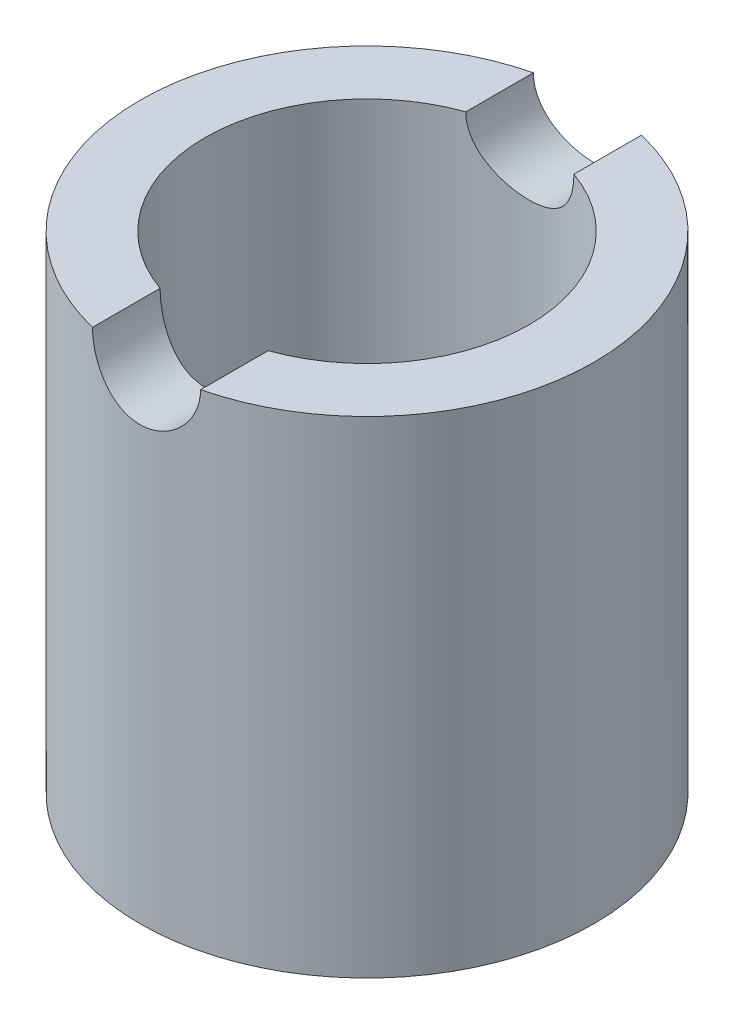
ISO-10303-21;
HEADER;
FILE_DESCRIPTION(('STEP AP214'),'2;1');
FILE_NAME('part.step','',(''),(''),'','','');
FILE_SCHEMA(('AUTOMOTIVE_DESIGN { 1 0 10303 214 1 1 1 1 }'));
ENDSEC;
DATA;
#1=APPLICATION_CONTEXT('core data for automotive mechanical design processes');
#2=APPLICATION_PROTOCOL_DEFINITION('international standard','automotive_design',2000,#1);
#3=PRODUCT_CONTEXT('',#1,'mechanical');
#4=PRODUCT('Part','Part','',(#3));
#5=PRODUCT_RELATED_PRODUCT_CATEGORY('part','',(#4));
#6=PRODUCT_DEFINITION_FORMATION('','',#4);
#7=PRODUCT_DEFINITION_CONTEXT('part definition',#1,'design');
#8=PRODUCT_DEFINITION('design','',#6,#7);
#9=PRODUCT_DEFINITION_SHAPE('','',#8);
#10=(LENGTH_UNIT() NAMED_UNIT(*) SI_UNIT(.MILLI.,.METRE.));
#11=(NAMED_UNIT(*) PLANE_ANGLE_UNIT() SI_UNIT($,.RADIAN.));
#12=(NAMED_UNIT(*) SI_UNIT($,.STERADIAN.) SOLID_ANGLE_UNIT());
#13=UNCERTAINTY_MEASURE_WITH_UNIT(LENGTH_MEASURE(1.E-05),#10,'distance_accuracy_value','');
#14=(GEOMETRIC_REPRESENTATION_CONTEXT(3) GLOBAL_UNCERTAINTY_ASSIGNED_CONTEXT((#13)) GLOBAL_UNIT_ASSIGNED_CONTEXT((#10,
#11,#12)) REPRESENTATION_CONTEXT('',''));
#15=CARTESIAN_POINT('',(0.,0.,0.));
#16=DIRECTION('',(0.,0.,1.));
#17=DIRECTION('',(1.,0.,0.));
#18=AXIS2_PLACEMENT_3D('',#15,#16,#17);
#19=CARTESIAN_POINT('',(0.,12.5,0.));
#20=DIRECTION('',(0.,1.,0.));
#21=DIRECTION('',(0.,0.,1.));
#22=AXIS2_PLACEMENT_3D('',#19,#20,#21);
#23=PLANE('',#22);
#24=DIRECTION('',(0.,0.,1.));
#25=VECTOR('',#24,1.);
#26=CARTESIAN_POINT('',(-1.,12.5,-50.));
#27=LINE('',#26,#25);
#28=CARTESIAN_POINT('',(-1.,12.5,-4.07921561087423));
#29=VERTEX_POINT('',#28);
#30=CARTESIAN_POINT('',(-1.,12.5,-2.82842712474619));
#31=VERTEX_POINT('',#30);
#32=EDGE_CURVE('E12',#29,#31,#27,.T.);
#33=ORIENTED_EDGE('',*,*,#32,.F.);
#34=CARTESIAN_POINT('',(0.,12.5,0.));
#35=DIRECTION('',(0.,1.,0.));
#36=DIRECTION('',(0.,0.,1.));
#37=AXIS2_PLACEMENT_3D('',#34,#35,#36);
#38=CIRCLE('',#37,4.2);
#39=CARTESIAN_POINT('',(-1.,12.5,4.07921561087423));
#40=VERTEX_POINT('',#39);
#41=EDGE_CURVE('E97',#29,#40,#38,.T.);
#42=ORIENTED_EDGE('',*,*,#41,.T.);
#43=CARTESIAN_POINT('',(-1.,12.5,2.82842712474619));
#44=VERTEX_POINT('',#43);
#45=EDGE_CURVE('E49',#44,#40,#27,.T.);
#46=ORIENTED_EDGE('',*,*,#45,.F.);
#47=CARTESIAN_POINT('',(0.,12.5,0.));
#48=DIRECTION('',(0.,1.,0.));
#49=DIRECTION('',(0.,0.,1.));
#50=AXIS2_PLACEMENT_3D('',#47,#48,#49);
#51=CIRCLE('',#50,3.);
#52=EDGE_CURVE('E101',#31,#44,#51,.T.);
#53=ORIENTED_EDGE('',*,*,#52,.F.);
#54=EDGE_LOOP('',(#33,#42,#46,#53));
#55=FACE_BOUND('',#54,.T.);
#56=ADVANCED_FACE('F40',(#55),#23,.T.);
#57=CARTESIAN_POINT('',(0.,13.5,0.));
#58=DIRECTION('',(0.,-1.,0.));
#59=DIRECTION('',(0.,0.,-1.));
#60=AXIS2_PLACEMENT_3D('',#57,#58,#59);
#61=CYLINDRICAL_SURFACE('',#60,4.2);
#62=CARTESIAN_POINT('',(0.,3.5,0.));
#63=DIRECTION('',(0.,1.,0.));
#64=DIRECTION('',(0.,0.,1.));
#65=AXIS2_PLACEMENT_3D('',#62,#63,#64);
#66=CIRCLE('',#65,4.2);
#67=CARTESIAN_POINT('',(0.,3.5,4.2));
#68=VERTEX_POINT('',#67);
#69=EDGE_CURVE('E89',#68,#68,#66,.T.);
#70=ORIENTED_EDGE('',*,*,#69,.T.);
#71=EDGE_LOOP('',(#70));
#72=FACE_BOUND('',#71,.T.);
#73=CARTESIAN_POINT('',(1.,12.5,4.07921561087423));
#74=VERTEX_POINT('',#73);
#75=CARTESIAN_POINT('',(1.,12.5,-4.07921561087423));
#76=VERTEX_POINT('',#75);
#77=EDGE_CURVE('E95',#74,#76,#38,.T.);
#78=ORIENTED_EDGE('',*,*,#77,.F.);
#79=CARTESIAN_POINT('',(1.,12.5,4.07921561087423));
#80=CARTESIAN_POINT('',(1.00000028866445,12.4722928513978,4.07921385729179));
#81=CARTESIAN_POINT('',(0.998847737989021,12.4445993861076,4.07949826172444));
#82=CARTESIAN_POINT('',(0.994252862033654,12.3894186931219,4.08062122270188));
#83=CARTESIAN_POINT('',(0.990810895379157,12.3619314338072,4.08145969245499));
#84=CARTESIAN_POINT('',(0.977099297795905,12.2801839170495,4.08477302940737));
#85=CARTESIAN_POINT('',(0.96344376413407,12.226484017181,4.08804602149814));
#86=CARTESIAN_POINT('',(0.927539581291437,12.1222234318764,4.09634045445134));
#87=CARTESIAN_POINT('',(0.905291282508934,12.0716626185313,4.1013618240171));
#88=CARTESIAN_POINT('',(0.852857561080181,11.9749682801077,4.11258440436218));
#89=CARTESIAN_POINT('',(0.822670345045109,11.9288357585914,4.11878588163836));
#90=CARTESIAN_POINT('',(0.754579677552106,11.8414149393472,4.131806983337));
#91=CARTESIAN_POINT('',(0.71654813700411,11.8002277830965,4.13863566411902));
#92=CARTESIAN_POINT('',(0.634120809641701,11.7247490317796,4.15206354619388));
#93=CARTESIAN_POINT('',(0.589724016940662,11.690458528638,4.15866271101162));
#94=CARTESIAN_POINT('',(0.495136870614496,11.6293398968948,4.17098776895646));
#95=CARTESIAN_POINT('',(0.444880717353495,11.6026109696972,4.17670164469384));
#96=CARTESIAN_POINT('',(0.340433008010099,11.558018933448,4.1865084061975));
#97=CARTESIAN_POINT('',(0.286242178465988,11.5401541923721,4.19060159032837));
#98=CARTESIAN_POINT('',(0.176521474125377,11.514119489958,4.19664175216457));
#99=CARTESIAN_POINT('',(0.121034709395654,11.5057768548603,4.19862690893658));
#100=CARTESIAN_POINT('',(0.00941478625985649,11.4984819471705,4.20036010912058));
#101=CARTESIAN_POINT('',(-0.0467182989222833,11.4995286210841,4.20010840351186));
#102=CARTESIAN_POINT('',(-0.156840123961553,11.5108570439073,4.19742487299487));
#103=CARTESIAN_POINT('',(-0.210849281354803,11.5209523026346,4.19503707460045));
#104=CARTESIAN_POINT('',(-0.316383451307761,11.5497924924599,4.18840050470215));
#105=CARTESIAN_POINT('',(-0.36790836006791,11.5685377846376,4.1841516555125));
#106=CARTESIAN_POINT('',(-0.467514325211135,11.6143025760893,4.17420160065372));
#107=CARTESIAN_POINT('',(-0.515562818333714,11.6413902547477,4.16848849521232));
#108=CARTESIAN_POINT('',(-0.606497420693284,11.7030189684494,4.15623257050554));
#109=CARTESIAN_POINT('',(-0.649382838295545,11.7375610003354,4.14968964031912));
#110=CARTESIAN_POINT('',(-0.729881861235412,11.8141190469341,4.13630034227589));
#111=CARTESIAN_POINT('',(-0.767340661192716,11.856297365091,4.12945046736761));
#112=CARTESIAN_POINT('',(-0.834694798344721,11.9464213871939,4.11636558617676));
#113=CARTESIAN_POINT('',(-0.864588070021568,11.9943686609025,4.1101307480926));
#114=CARTESIAN_POINT('',(-0.916051408971658,12.0949595391781,4.09896926871928));
#115=CARTESIAN_POINT('',(-0.937582685197239,12.1476236688263,4.09404875669891));
#116=CARTESIAN_POINT('',(-0.971411828335731,12.255936917658,4.08615539302507));
#117=CARTESIAN_POINT('',(-0.983723468116298,12.311581450735,4.08317963702381));
#118=CARTESIAN_POINT('',(-0.994151064052436,12.3897489344417,4.08064572451124));
#119=CARTESIAN_POINT('',(-0.996344902857638,12.4117571626947,4.08011019451205));
#120=CARTESIAN_POINT('',(-0.999267668320482,12.4558401522509,4.07939533459649));
#121=CARTESIAN_POINT('',(-0.999998993866867,12.4779147450246,4.079215421385));
#122=CARTESIAN_POINT('',(-1.,12.5,4.07921561087423));
#123=B_SPLINE_CURVE_WITH_KNOTS('',3,(#79,#80,#81,#82,#83,#84,#85,#86,#87,#88,#89,#90,#91,#92,
#93,#94,#95,#96,#97,#98,#99,#100,#101,#102,#103,#104,#105,#106,#107,#108,#109,#110,#111,#112,
#113,#114,#115,#116,#117,#118,#119,#120,#121,#122),.UNSPECIFIED.,.F.,.F.,(4,2,2,2,2,2,2,2,2,2,2,
2,2,2,2,2,2,2,2,2,2,4),(0.,0.0830690823045678,0.16612515532082,0.331781604138719,
0.497431298482456,0.663118445019985,0.831762423627503,1.00043308210251,1.17122355161627,
1.34198256446669,1.50959322269553,1.67718507499575,1.84140034080337,2.00562246209496,
2.17122402264338,2.33684774220319,2.50652708646393,2.6762527062179,2.84675653239699,
3.01700513841686,3.08333574575819,3.14955746472772),.UNSPECIFIED.);
#124=EDGE_CURVE('E57',#74,#40,#123,.T.);
#125=ORIENTED_EDGE('',*,*,#124,.T.);
#126=ORIENTED_EDGE('',*,*,#41,.F.);
#127=CARTESIAN_POINT('',(-1.,12.5,-4.07921561087423));
#128=CARTESIAN_POINT('',(-1.00000028866445,12.4722928513978,-4.07921385729179));
#129=CARTESIAN_POINT('',(-0.998847737989021,12.4445993861076,-4.07949826172444));
#130=CARTESIAN_POINT('',(-0.994252862033654,12.3894186931219,-4.08062122270188));
#131=CARTESIAN_POINT('',(-0.990810895379157,12.3619314338072,-4.08145969245499));
#132=CARTESIAN_POINT('',(-0.977099297795905,12.2801839170495,-4.08477302940737));
#133=CARTESIAN_POINT('',(-0.96344376413407,12.226484017181,-4.08804602149814));
#134=CARTESIAN_POINT('',(-0.927539581291437,12.1222234318764,-4.09634045445134));
#135=CARTESIAN_POINT('',(-0.905291282508934,12.0716626185313,-4.1013618240171));
#136=CARTESIAN_POINT('',(-0.852857561080181,11.9749682801077,-4.11258440436218));
#137=CARTESIAN_POINT('',(-0.822670345045109,11.9288357585914,-4.11878588163836));
#138=CARTESIAN_POINT('',(-0.754579677552106,11.8414149393472,-4.131806983337));
#139=CARTESIAN_POINT('',(-0.71654813700411,11.8002277830965,-4.13863566411902));
#140=CARTESIAN_POINT('',(-0.634120809641701,11.7247490317796,-4.15206354619388));
#141=CARTESIAN_POINT('',(-0.589724016940662,11.690458528638,-4.15866271101162));
#142=CARTESIAN_POINT('',(-0.495136870614496,11.6293398968948,-4.17098776895646));
#143=CARTESIAN_POINT('',(-0.444880717353495,11.6026109696972,-4.17670164469384));
#144=CARTESIAN_POINT('',(-0.340433008010099,11.558018933448,-4.1865084061975));
#145=CARTESIAN_POINT('',(-0.286242178465988,11.5401541923721,-4.19060159032837));
#146=CARTESIAN_POINT('',(-0.176521474125377,11.514119489958,-4.19664175216457));
#147=CARTESIAN_POINT('',(-0.121034709395654,11.5057768548603,-4.19862690893658));
#148=CARTESIAN_POINT('',(-0.00941478625985649,11.4984819471705,-4.20036010912058));
#149=CARTESIAN_POINT('',(0.0467182989222833,11.4995286210841,-4.20010840351186));
#150=CARTESIAN_POINT('',(0.156840123961553,11.5108570439073,-4.19742487299487));
#151=CARTESIAN_POINT('',(0.210849281354803,11.5209523026346,-4.19503707460045));
#152=CARTESIAN_POINT('',(0.316383451307761,11.5497924924599,-4.18840050470215));
#153=CARTESIAN_POINT('',(0.36790836006791,11.5685377846376,-4.1841516555125));
#154=CARTESIAN_POINT('',(0.467514325211135,11.6143025760893,-4.17420160065372));
#155=CARTESIAN_POINT('',(0.515562818333714,11.6413902547477,-4.16848849521232));
#156=CARTESIAN_POINT('',(0.606497420693284,11.7030189684494,-4.15623257050554));
#157=CARTESIAN_POINT('',(0.649382838295545,11.7375610003354,-4.14968964031912));
#158=CARTESIAN_POINT('',(0.729881861235412,11.8141190469341,-4.13630034227589));
#159=CARTESIAN_POINT('',(0.767340661192716,11.856297365091,-4.12945046736761));
#160=CARTESIAN_POINT('',(0.834694798344721,11.9464213871939,-4.11636558617676));
#161=CARTESIAN_POINT('',(0.864588070021568,11.9943686609025,-4.1101307480926));
#162=CARTESIAN_POINT('',(0.916051408971658,12.0949595391781,-4.09896926871928));
#163=CARTESIAN_POINT('',(0.937582685197239,12.1476236688263,-4.09404875669891));
#164=CARTESIAN_POINT('',(0.971411828335731,12.255936917658,-4.08615539302507));
#165=CARTESIAN_POINT('',(0.983723468116298,12.311581450735,-4.08317963702381));
#166=CARTESIAN_POINT('',(0.994151064052436,12.3897489344417,-4.08064572451124));
#167=CARTESIAN_POINT('',(0.996344902857638,12.4117571626947,-4.08011019451205));
#168=CARTESIAN_POINT('',(0.999267668320482,12.4558401522509,-4.07939533459649));
#169=CARTESIAN_POINT('',(0.999998993866867,12.4779147450246,-4.079215421385));
#170=CARTESIAN_POINT('',(1.,12.5,-4.07921561087423));
#171=B_SPLINE_CURVE_WITH_KNOTS('',3,(#127,#128,#129,#130,#131,#132,#133,#134,#135,#136,#137,
#138,#139,#140,#141,#142,#143,#144,#145,#146,#147,#148,#149,#150,#151,#152,#153,#154,#155,#156,
#157,#158,#159,#160,#161,#162,#163,#164,#165,#166,#167,#168,#169,#170),.UNSPECIFIED.,.F.,.F.,(4,
2,2,2,2,2,2,2,2,2,2,2,2,2,2,2,2,2,2,2,2,4),(0.,0.0830690823045678,0.16612515532082,
0.331781604138719,0.497431298482456,0.663118445019985,0.831762423627503,1.00043308210251,
1.17122355161627,1.34198256446669,1.50959322269553,1.67718507499575,1.84140034080337,
2.00562246209496,2.17122402264338,2.33684774220319,2.50652708646393,2.6762527062179,
2.84675653239699,3.01700513841686,3.08333574575819,3.14955746472772),.UNSPECIFIED.);
#172=EDGE_CURVE('E82',#29,#76,#171,.T.);
#173=ORIENTED_EDGE('',*,*,#172,.T.);
#174=EDGE_LOOP('',(#78,#125,#126,#173));
#175=FACE_BOUND('',#174,.T.);
#176=ADVANCED_FACE('F94',(#72,#175),#61,.T.);
#177=CARTESIAN_POINT('',(0.,13.5,0.));
#178=DIRECTION('',(0.,-1.,0.));
#179=DIRECTION('',(0.,0.,-1.));
#180=AXIS2_PLACEMENT_3D('',#177,#178,#179);
#181=CYLINDRICAL_SURFACE('',#180,3.);
#182=CARTESIAN_POINT('',(1.,12.5,2.82842712474619));
#183=CARTESIAN_POINT('',(1.0000007474592,12.4727095031989,2.82842442094339));
#184=CARTESIAN_POINT('',(0.998882124587393,12.4454329378107,2.82882259943245));
#185=CARTESIAN_POINT('',(0.994425607036402,12.3910914159451,2.83039327289221));
#186=CARTESIAN_POINT('',(0.991088311433525,12.3640264043403,2.83156555884122));
#187=CARTESIAN_POINT('',(0.977810675230789,12.2836078568049,2.83619092224651));
#188=CARTESIAN_POINT('',(0.964604233028114,12.2308191537295,2.84075292499515));
#189=CARTESIAN_POINT('',(0.929958411830429,12.1283748075562,2.85228074698859));
#190=CARTESIAN_POINT('',(0.908523575987535,12.0787174531271,2.85924523952929));
#191=CARTESIAN_POINT('',(0.858073228964871,11.9836601659945,2.87478787219461));
#192=CARTESIAN_POINT('',(0.829053062822737,11.9382628709327,2.88336700228108));
#193=CARTESIAN_POINT('',(0.763051393523013,11.8512797686755,2.90154480402047));
#194=CARTESIAN_POINT('',(0.725824980322038,11.8098851195374,2.91116877768309));
#195=CARTESIAN_POINT('',(0.644988442991484,11.7337939822083,2.93013848692978));
#196=CARTESIAN_POINT('',(0.601377184554537,11.6990986867441,2.93948417271853));
#197=CARTESIAN_POINT('',(0.507603645956265,11.6365204811958,2.95713882994227));
#198=CARTESIAN_POINT('',(0.457300089358498,11.6088390155977,2.96541437561854));
#199=CARTESIAN_POINT('',(0.35242924996586,11.5624077483127,2.97969608604658));
#200=CARTESIAN_POINT('',(0.297863275593421,11.5436552181796,2.98570294393309));
#201=CARTESIAN_POINT('',(0.188029345478037,11.5162642739086,2.99459071142922));
#202=CARTESIAN_POINT('',(0.132851834460112,11.5072967274463,2.99757308988573));
#203=CARTESIAN_POINT('',(0.0216989694556728,11.4986837014744,3.00043608403817));
#204=CARTESIAN_POINT('',(-0.0342761912453928,11.4990360007302,3.00031743881302));
#205=CARTESIAN_POINT('',(-0.143103845279393,11.5088442831067,2.99706038635266));
#206=CARTESIAN_POINT('',(-0.195992702625537,11.5179426379595,2.99404060991264));
#207=CARTESIAN_POINT('',(-0.299444064376656,11.5443931986741,2.98546960500824));
#208=CARTESIAN_POINT('',(-0.350006439616464,11.5617458622063,2.97991823617731));
#209=CARTESIAN_POINT('',(-0.448152623030962,11.6044213696006,2.96675668271304));
#210=CARTESIAN_POINT('',(-0.495688505653993,11.6298460451223,2.95912037838312));
#211=CARTESIAN_POINT('',(-0.585924589097489,11.6878599513907,2.94258387680044));
#212=CARTESIAN_POINT('',(-0.628623469714685,11.7204511310465,2.93368333597593));
#213=CARTESIAN_POINT('',(-0.710097339711213,11.7936710499968,2.91506271942739));
#214=CARTESIAN_POINT('',(-0.7485936116127,11.8346055436097,2.90532378679914));
#215=CARTESIAN_POINT('',(-0.818272024820384,11.9224414897162,2.88647490472851));
#216=CARTESIAN_POINT('',(-0.849451803183813,11.9693448624032,2.87736515915753));
#217=CARTESIAN_POINT('',(-0.904003325592784,12.0686801783533,2.86070031376318));
#218=CARTESIAN_POINT('',(-0.927253009507683,12.1211835149329,2.85317014948234));
#219=CARTESIAN_POINT('',(-0.964460230701117,12.22964697759,2.84081097062039));
#220=CARTESIAN_POINT('',(-0.978432436055357,12.2856014933722,2.83597769408993));
#221=CARTESIAN_POINT('',(-0.991658156280829,12.368418636748,2.8313654209472));
#222=CARTESIAN_POINT('',(-0.994785061255116,12.3946413898542,2.83026667694602));
#223=CARTESIAN_POINT('',(-0.998954616071198,12.4472380783998,2.82879703571399));
#224=CARTESIAN_POINT('',(-0.999999955394979,12.4736117745444,2.82842519929528));
#225=CARTESIAN_POINT('',(-1.,12.5,2.82842712474619));
#226=B_SPLINE_CURVE_WITH_KNOTS('',3,(#182,#183,#184,#185,#186,#187,#188,#189,#190,#191,#192,
#193,#194,#195,#196,#197,#198,#199,#200,#201,#202,#203,#204,#205,#206,#207,#208,#209,#210,#211,
#212,#213,#214,#215,#216,#217,#218,#219,#220,#221,#222,#223,#224,#225),.UNSPECIFIED.,.F.,.F.,(4,
2,2,2,2,2,2,2,2,2,2,2,2,2,2,2,2,2,2,2,2,4),(0.,0.0818184847354318,0.163614886169461,
0.326581198395373,0.489457660966235,0.65243431313531,0.821165049626776,0.989925798637472,
1.16309132933101,1.33620391121127,1.50329470727403,1.67034568030642,1.83084418465735,
1.99135158908248,2.15397018825968,2.31663306588769,2.4869405405805,2.65730294249242,
2.8301802992804,3.00278367486839,3.08199895332752,3.16111181529057),.UNSPECIFIED.);
#227=CARTESIAN_POINT('',(1.,12.5,2.82842712474619));
#228=VERTEX_POINT('',#227);
#229=EDGE_CURVE('E98',#228,#44,#226,.T.);
#230=ORIENTED_EDGE('',*,*,#229,.F.);
#231=CARTESIAN_POINT('',(1.,12.5,-2.82842712474619));
#232=VERTEX_POINT('',#231);
#233=EDGE_CURVE('E104',#228,#232,#51,.T.);
#234=ORIENTED_EDGE('',*,*,#233,.T.);
#235=CARTESIAN_POINT('',(-1.,12.5,-2.82842712474619));
#236=CARTESIAN_POINT('',(-1.0000007474592,12.4727095031989,-2.82842442094339));
#237=CARTESIAN_POINT('',(-0.998882124587393,12.4454329378107,-2.82882259943245));
#238=CARTESIAN_POINT('',(-0.994425607036402,12.3910914159451,-2.83039327289221));
#239=CARTESIAN_POINT('',(-0.991088311433525,12.3640264043403,-2.83156555884122));
#240=CARTESIAN_POINT('',(-0.977810675230789,12.2836078568049,-2.83619092224651));
#241=CARTESIAN_POINT('',(-0.964604233028114,12.2308191537295,-2.84075292499515));
#242=CARTESIAN_POINT('',(-0.929958411830429,12.1283748075562,-2.85228074698859));
#243=CARTESIAN_POINT('',(-0.908523575987535,12.0787174531271,-2.85924523952929));
#244=CARTESIAN_POINT('',(-0.858073228964871,11.9836601659945,-2.87478787219461));
#245=CARTESIAN_POINT('',(-0.829053062822737,11.9382628709327,-2.88336700228108));
#246=CARTESIAN_POINT('',(-0.763051393523013,11.8512797686755,-2.90154480402047));
#247=CARTESIAN_POINT('',(-0.725824980322038,11.8098851195374,-2.91116877768309));
#248=CARTESIAN_POINT('',(-0.644988442991484,11.7337939822083,-2.93013848692978));
#249=CARTESIAN_POINT('',(-0.601377184554537,11.6990986867441,-2.93948417271853));
#250=CARTESIAN_POINT('',(-0.507603645956265,11.6365204811958,-2.95713882994227));
#251=CARTESIAN_POINT('',(-0.457300089358498,11.6088390155977,-2.96541437561854));
#252=CARTESIAN_POINT('',(-0.35242924996586,11.5624077483127,-2.97969608604658));
#253=CARTESIAN_POINT('',(-0.297863275593421,11.5436552181796,-2.98570294393309));
#254=CARTESIAN_POINT('',(-0.188029345478037,11.5162642739086,-2.99459071142922));
#255=CARTESIAN_POINT('',(-0.132851834460112,11.5072967274463,-2.99757308988573));
#256=CARTESIAN_POINT('',(-0.0216989694556728,11.4986837014744,-3.00043608403817));
#257=CARTESIAN_POINT('',(0.0342761912453928,11.4990360007302,-3.00031743881302));
#258=CARTESIAN_POINT('',(0.143103845279393,11.5088442831067,-2.99706038635266));
#259=CARTESIAN_POINT('',(0.195992702625537,11.5179426379595,-2.99404060991264));
#260=CARTESIAN_POINT('',(0.299444064376656,11.5443931986741,-2.98546960500824));
#261=CARTESIAN_POINT('',(0.350006439616464,11.5617458622063,-2.97991823617731));
#262=CARTESIAN_POINT('',(0.448152623030962,11.6044213696006,-2.96675668271304));
#263=CARTESIAN_POINT('',(0.495688505653993,11.6298460451223,-2.95912037838312));
#264=CARTESIAN_POINT('',(0.585924589097489,11.6878599513907,-2.94258387680044));
#265=CARTESIAN_POINT('',(0.628623469714685,11.7204511310465,-2.93368333597593));
#266=CARTESIAN_POINT('',(0.710097339711213,11.7936710499968,-2.91506271942739));
#267=CARTESIAN_POINT('',(0.7485936116127,11.8346055436097,-2.90532378679914));
#268=CARTESIAN_POINT('',(0.818272024820384,11.9224414897162,-2.88647490472851));
#269=CARTESIAN_POINT('',(0.849451803183813,11.9693448624032,-2.87736515915753));
#270=CARTESIAN_POINT('',(0.904003325592784,12.0686801783533,-2.86070031376318));
#271=CARTESIAN_POINT('',(0.927253009507683,12.1211835149329,-2.85317014948234));
#272=CARTESIAN_POINT('',(0.964460230701117,12.22964697759,-2.84081097062039));
#273=CARTESIAN_POINT('',(0.978432436055357,12.2856014933722,-2.83597769408993));
#274=CARTESIAN_POINT('',(0.991658156280829,12.368418636748,-2.8313654209472));
#275=CARTESIAN_POINT('',(0.994785061255116,12.3946413898542,-2.83026667694602));
#276=CARTESIAN_POINT('',(0.998954616071198,12.4472380783998,-2.82879703571399));
#277=CARTESIAN_POINT('',(0.999999955394979,12.4736117745444,-2.82842519929528));
#278=CARTESIAN_POINT('',(1.,12.5,-2.82842712474619));
#279=B_SPLINE_CURVE_WITH_KNOTS('',3,(#235,#236,#237,#238,#239,#240,#241,#242,#243,#244,#245,
#246,#247,#248,#249,#250,#251,#252,#253,#254,#255,#256,#257,#258,#259,#260,#261,#262,#263,#264,
#265,#266,#267,#268,#269,#270,#271,#272,#273,#274,#275,#276,#277,#278),.UNSPECIFIED.,.F.,.F.,(4,
2,2,2,2,2,2,2,2,2,2,2,2,2,2,2,2,2,2,2,2,4),(0.,0.0818184847354318,0.163614886169461,
0.326581198395373,0.489457660966235,0.65243431313531,0.821165049626776,0.989925798637472,
1.16309132933101,1.33620391121127,1.50329470727403,1.67034568030642,1.83084418465735,
1.99135158908248,2.15397018825968,2.31663306588769,2.4869405405805,2.65730294249242,
2.8301802992804,3.00278367486839,3.08199895332752,3.16111181529057),.UNSPECIFIED.);
#280=EDGE_CURVE('E64',#31,#232,#279,.T.);
#281=ORIENTED_EDGE('',*,*,#280,.F.);
#282=ORIENTED_EDGE('',*,*,#52,.T.);
#283=EDGE_LOOP('',(#230,#234,#281,#282));
#284=FACE_BOUND('',#283,.T.);
#285=CARTESIAN_POINT('',(0.,3.5,0.));
#286=DIRECTION('',(0.,1.,0.));
#287=DIRECTION('',(0.,0.,1.));
#288=AXIS2_PLACEMENT_3D('',#285,#286,#287);
#289=CIRCLE('',#288,3.);
#290=CARTESIAN_POINT('',(0.,3.5,3.));
#291=VERTEX_POINT('',#290);
#292=EDGE_CURVE('E44',#291,#291,#289,.T.);
#293=ORIENTED_EDGE('',*,*,#292,.F.);
#294=EDGE_LOOP('',(#293));
#295=FACE_BOUND('',#294,.T.);
#296=ADVANCED_FACE('F120',(#284,#295),#181,.F.);
#297=CARTESIAN_POINT('',(0.,3.5,0.));
#298=DIRECTION('',(0.,1.,0.));
#299=DIRECTION('',(0.,0.,1.));
#300=AXIS2_PLACEMENT_3D('',#297,#298,#299);
#301=PLANE('',#300);
#302=ORIENTED_EDGE('',*,*,#69,.F.);
#303=EDGE_LOOP('',(#302));
#304=FACE_BOUND('',#303,.T.);
#305=ORIENTED_EDGE('',*,*,#292,.T.);
#306=EDGE_LOOP('',(#305));
#307=FACE_BOUND('',#306,.T.);
#308=ADVANCED_FACE('F42',(#304,#307),#301,.F.);
#309=DIRECTION('',(0.,0.,1.));
#310=VECTOR('',#309,1.);
#311=CARTESIAN_POINT('',(1.,12.5,-50.));
#312=LINE('',#311,#310);
#313=EDGE_CURVE('E88',#74,#228,#312,.F.);
#314=ORIENTED_EDGE('',*,*,#313,.F.);
#315=ORIENTED_EDGE('',*,*,#77,.T.);
#316=EDGE_CURVE('E79',#232,#76,#312,.F.);
#317=ORIENTED_EDGE('',*,*,#316,.F.);
#318=ORIENTED_EDGE('',*,*,#233,.F.);
#319=EDGE_LOOP('',(#314,#315,#317,#318));
#320=FACE_BOUND('',#319,.T.);
#321=ADVANCED_FACE('F100',(#320),#23,.T.);
#322=CARTESIAN_POINT('',(0.,12.5,-50.));
#323=DIRECTION('',(0.,0.,1.));
#324=DIRECTION('',(1.,0.,0.));
#325=AXIS2_PLACEMENT_3D('',#322,#323,#324);
#326=CYLINDRICAL_SURFACE('',#325,1.);
#327=ORIENTED_EDGE('',*,*,#32,.T.);
#328=ORIENTED_EDGE('',*,*,#280,.T.);
#329=ORIENTED_EDGE('',*,*,#316,.T.);
#330=ORIENTED_EDGE('',*,*,#172,.F.);
#331=EDGE_LOOP('',(#327,#328,#329,#330));
#332=FACE_BOUND('',#331,.T.);
#333=ADVANCED_FACE('F81',(#332),#326,.F.);
#334=ORIENTED_EDGE('',*,*,#45,.T.);
#335=ORIENTED_EDGE('',*,*,#124,.F.);
#336=ORIENTED_EDGE('',*,*,#313,.T.);
#337=ORIENTED_EDGE('',*,*,#229,.T.);
#338=EDGE_LOOP('',(#334,#335,#336,#337));
#339=FACE_BOUND('',#338,.T.);
#340=ADVANCED_FACE('F140',(#339),#326,.F.);
#341=CLOSED_SHELL('',(#56,#176,#296,#308,#321,#333,#340));
#342=MANIFOLD_SOLID_BREP('B2',#341);
#343=ADVANCED_BREP_SHAPE_REPRESENTATION('',(#18,#342),#14);
#344=SHAPE_DEFINITION_REPRESENTATION(#9,#343);
ENDSEC;
END-ISO-10303-21;
